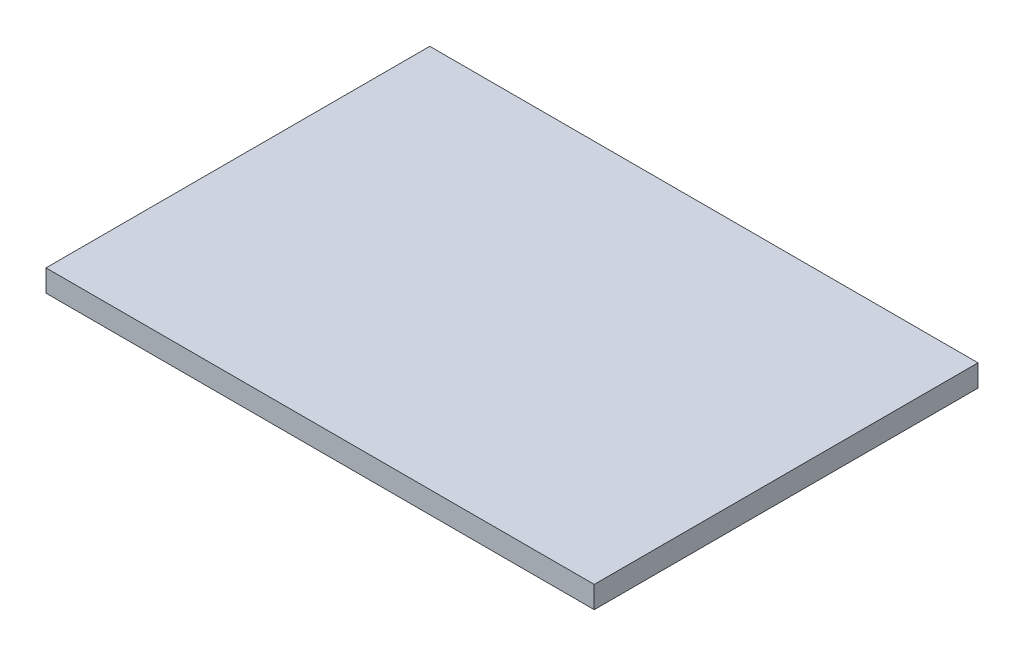
ISO-10303-21;
HEADER;
FILE_DESCRIPTION(('STEP AP214'),'2;1');
FILE_NAME('part.step','',(''),(''),'','','');
FILE_SCHEMA(('AUTOMOTIVE_DESIGN { 1 0 10303 214 1 1 1 1 }'));
ENDSEC;
DATA;
#1=APPLICATION_CONTEXT('core data for automotive mechanical design processes');
#2=APPLICATION_PROTOCOL_DEFINITION('international standard','automotive_design',2000,#1);
#3=PRODUCT_CONTEXT('',#1,'mechanical');
#4=PRODUCT('Part','Part','',(#3));
#5=PRODUCT_RELATED_PRODUCT_CATEGORY('part','',(#4));
#6=PRODUCT_DEFINITION_FORMATION('','',#4);
#7=PRODUCT_DEFINITION_CONTEXT('part definition',#1,'design');
#8=PRODUCT_DEFINITION('design','',#6,#7);
#9=PRODUCT_DEFINITION_SHAPE('','',#8);
#10=(LENGTH_UNIT() NAMED_UNIT(*) SI_UNIT(.MILLI.,.METRE.));
#11=(NAMED_UNIT(*) PLANE_ANGLE_UNIT() SI_UNIT($,.RADIAN.));
#12=(NAMED_UNIT(*) SI_UNIT($,.STERADIAN.) SOLID_ANGLE_UNIT());
#13=UNCERTAINTY_MEASURE_WITH_UNIT(LENGTH_MEASURE(1.E-05),#10,'distance_accuracy_value','');
#14=(GEOMETRIC_REPRESENTATION_CONTEXT(3) GLOBAL_UNCERTAINTY_ASSIGNED_CONTEXT((#13)) GLOBAL_UNIT_ASSIGNED_CONTEXT((#10,
#11,#12)) REPRESENTATION_CONTEXT('',''));
#15=CARTESIAN_POINT('',(0.,0.,0.));
#16=DIRECTION('',(0.,0.,1.));
#17=DIRECTION('',(1.,0.,0.));
#18=AXIS2_PLACEMENT_3D('',#15,#16,#17);
#19=CARTESIAN_POINT('',(13.97,127.,-13.97));
#20=DIRECTION('',(-1.,0.,0.));
#21=DIRECTION('',(0.,0.,1.));
#22=AXIS2_PLACEMENT_3D('',#19,#20,#21);
#23=PLANE('',#22);
#24=CARTESIAN_POINT('',(13.97,96.52,0.));
#25=DIRECTION('',(1.,0.,0.));
#26=DIRECTION('',(0.,0.,-1.));
#27=AXIS2_PLACEMENT_3D('',#24,#25,#26);
#28=CIRCLE('',#27,6.35);
#29=CARTESIAN_POINT('',(13.97,96.52,-6.35));
#30=VERTEX_POINT('',#29);
#31=EDGE_CURVE('E236',#30,#30,#28,.T.);
#32=ORIENTED_EDGE('',*,*,#31,.F.);
#33=EDGE_LOOP('',(#32));
#34=FACE_BOUND('',#33,.T.);
#35=CARTESIAN_POINT('',(13.97,78.74,0.));
#36=DIRECTION('',(1.,0.,0.));
#37=DIRECTION('',(0.,0.,-1.));
#38=AXIS2_PLACEMENT_3D('',#35,#36,#37);
#39=CIRCLE('',#38,6.35);
#40=CARTESIAN_POINT('',(13.97,78.74,-6.35));
#41=VERTEX_POINT('',#40);
#42=EDGE_CURVE('E235',#41,#41,#39,.T.);
#43=ORIENTED_EDGE('',*,*,#42,.F.);
#44=EDGE_LOOP('',(#43));
#45=FACE_BOUND('',#44,.T.);
#46=CARTESIAN_POINT('',(13.97,60.96,0.));
#47=DIRECTION('',(1.,0.,0.));
#48=DIRECTION('',(0.,0.,-1.));
#49=AXIS2_PLACEMENT_3D('',#46,#47,#48);
#50=CIRCLE('',#49,6.35);
#51=CARTESIAN_POINT('',(13.97,60.96,-6.35));
#52=VERTEX_POINT('',#51);
#53=EDGE_CURVE('E244',#52,#52,#50,.T.);
#54=ORIENTED_EDGE('',*,*,#53,.F.);
#55=EDGE_LOOP('',(#54));
#56=FACE_BOUND('',#55,.T.);
#57=CARTESIAN_POINT('',(13.97,43.18,0.));
#58=DIRECTION('',(1.,0.,0.));
#59=DIRECTION('',(0.,0.,-1.));
#60=AXIS2_PLACEMENT_3D('',#57,#58,#59);
#61=CIRCLE('',#60,6.35);
#62=CARTESIAN_POINT('',(13.97,43.18,-6.35));
#63=VERTEX_POINT('',#62);
#64=EDGE_CURVE('E252',#63,#63,#61,.T.);
#65=ORIENTED_EDGE('',*,*,#64,.F.);
#66=EDGE_LOOP('',(#65));
#67=FACE_BOUND('',#66,.T.);
#68=CARTESIAN_POINT('',(13.97,25.4,0.));
#69=DIRECTION('',(1.,0.,0.));
#70=DIRECTION('',(0.,0.,-1.));
#71=AXIS2_PLACEMENT_3D('',#68,#69,#70);
#72=CIRCLE('',#71,6.35);
#73=CARTESIAN_POINT('',(13.97,25.4,-6.35));
#74=VERTEX_POINT('',#73);
#75=EDGE_CURVE('E220',#74,#74,#72,.T.);
#76=ORIENTED_EDGE('',*,*,#75,.F.);
#77=EDGE_LOOP('',(#76));
#78=FACE_BOUND('',#77,.T.);
#79=DIRECTION('',(0.,0.,-1.));
#80=VECTOR('',#79,1.);
#81=CARTESIAN_POINT('',(13.97,127.,163.83));
#82=LINE('',#81,#80);
#83=CARTESIAN_POINT('',(13.97,127.,13.97));
#84=VERTEX_POINT('',#83);
#85=CARTESIAN_POINT('',(13.97,127.,-13.97));
#86=VERTEX_POINT('',#85);
#87=EDGE_CURVE('E11',#84,#86,#82,.T.);
#88=ORIENTED_EDGE('',*,*,#87,.F.);
#89=DIRECTION('',(0.,-1.,0.));
#90=VECTOR('',#89,1.);
#91=CARTESIAN_POINT('',(13.97,127.,13.97));
#92=LINE('',#91,#90);
#93=CARTESIAN_POINT('',(13.97,0.,13.97));
#94=VERTEX_POINT('',#93);
#95=EDGE_CURVE('E93',#84,#94,#92,.T.);
#96=ORIENTED_EDGE('',*,*,#95,.T.);
#97=DIRECTION('',(0.,0.,-1.));
#98=VECTOR('',#97,1.);
#99=CARTESIAN_POINT('',(13.97,0.,-13.97));
#100=LINE('',#99,#98);
#101=CARTESIAN_POINT('',(13.97,0.,-13.97));
#102=VERTEX_POINT('',#101);
#103=EDGE_CURVE('E106',#94,#102,#100,.T.);
#104=ORIENTED_EDGE('',*,*,#103,.T.);
#105=DIRECTION('',(0.,-1.,0.));
#106=VECTOR('',#105,1.);
#107=CARTESIAN_POINT('',(13.97,127.,-13.97));
#108=LINE('',#107,#106);
#109=EDGE_CURVE('E48',#86,#102,#108,.T.);
#110=ORIENTED_EDGE('',*,*,#109,.F.);
#111=EDGE_LOOP('',(#88,#96,#104,#110));
#112=FACE_BOUND('',#111,.T.);
#113=ADVANCED_FACE('F45',(#34,#45,#56,#67,#78,#112),#23,.F.);
#114=CARTESIAN_POINT('',(-13.97,127.,-13.97));
#115=DIRECTION('',(0.,0.,1.));
#116=DIRECTION('',(1.,0.,0.));
#117=AXIS2_PLACEMENT_3D('',#114,#115,#116);
#118=PLANE('',#117);
#119=DIRECTION('',(-1.,0.,0.));
#120=VECTOR('',#119,1.);
#121=CARTESIAN_POINT('',(-13.97,0.,-13.97));
#122=LINE('',#121,#120);
#123=CARTESIAN_POINT('',(-13.97,0.,-13.97));
#124=VERTEX_POINT('',#123);
#125=EDGE_CURVE('E112',#102,#124,#122,.T.);
#126=ORIENTED_EDGE('',*,*,#125,.T.);
#127=DIRECTION('',(0.,-1.,0.));
#128=VECTOR('',#127,1.);
#129=CARTESIAN_POINT('',(-13.97,127.,-13.97));
#130=LINE('',#129,#128);
#131=CARTESIAN_POINT('',(-13.97,127.,-13.97));
#132=VERTEX_POINT('',#131);
#133=EDGE_CURVE('E129',#132,#124,#130,.T.);
#134=ORIENTED_EDGE('',*,*,#133,.F.);
#135=DIRECTION('',(-1.,0.,0.));
#136=VECTOR('',#135,1.);
#137=CARTESIAN_POINT('',(13.97,127.,-13.97));
#138=LINE('',#137,#136);
#139=CARTESIAN_POINT('',(-36.83,127.,-13.97));
#140=VERTEX_POINT('',#139);
#141=EDGE_CURVE('E216',#132,#140,#138,.T.);
#142=ORIENTED_EDGE('',*,*,#141,.T.);
#143=DIRECTION('',(0.,-1.,0.));
#144=VECTOR('',#143,1.);
#145=CARTESIAN_POINT('',(-36.83,137.16,-13.97));
#146=LINE('',#145,#144);
#147=CARTESIAN_POINT('',(-36.83,137.16,-13.97));
#148=VERTEX_POINT('',#147);
#149=EDGE_CURVE('E198',#148,#140,#146,.T.);
#150=ORIENTED_EDGE('',*,*,#149,.F.);
#151=DIRECTION('',(-1.,0.,0.));
#152=VECTOR('',#151,1.);
#153=CARTESIAN_POINT('',(13.97,137.16,-13.97));
#154=LINE('',#153,#152);
#155=CARTESIAN_POINT('',(217.17,137.16,-13.97));
#156=VERTEX_POINT('',#155);
#157=EDGE_CURVE('E211',#156,#148,#154,.T.);
#158=ORIENTED_EDGE('',*,*,#157,.F.);
#159=DIRECTION('',(0.,1.,0.));
#160=VECTOR('',#159,1.);
#161=CARTESIAN_POINT('',(217.17,137.16,-13.97));
#162=LINE('',#161,#160);
#163=CARTESIAN_POINT('',(217.17,127.,-13.97));
#164=VERTEX_POINT('',#163);
#165=EDGE_CURVE('E276',#164,#156,#162,.T.);
#166=ORIENTED_EDGE('',*,*,#165,.F.);
#167=DIRECTION('',(-1.,0.,0.));
#168=VECTOR('',#167,1.);
#169=CARTESIAN_POINT('',(217.17,127.,-13.97));
#170=LINE('',#169,#168);
#171=EDGE_CURVE('E141',#164,#86,#170,.T.);
#172=ORIENTED_EDGE('',*,*,#171,.T.);
#173=ORIENTED_EDGE('',*,*,#109,.T.);
#174=EDGE_LOOP('',(#126,#134,#142,#150,#158,#166,#172,#173));
#175=FACE_BOUND('',#174,.T.);
#176=ADVANCED_FACE('F137',(#175),#118,.F.);
#177=CARTESIAN_POINT('',(-13.97,127.,-13.97));
#178=DIRECTION('',(1.,0.,0.));
#179=DIRECTION('',(0.,0.,-1.));
#180=AXIS2_PLACEMENT_3D('',#177,#178,#179);
#181=PLANE('',#180);
#182=DIRECTION('',(0.,0.,1.));
#183=VECTOR('',#182,1.);
#184=CARTESIAN_POINT('',(-13.97,0.,-13.97));
#185=LINE('',#184,#183);
#186=CARTESIAN_POINT('',(-13.97,0.,13.97));
#187=VERTEX_POINT('',#186);
#188=EDGE_CURVE('E100',#124,#187,#185,.T.);
#189=ORIENTED_EDGE('',*,*,#188,.T.);
#190=DIRECTION('',(0.,-1.,0.));
#191=VECTOR('',#190,1.);
#192=CARTESIAN_POINT('',(-13.97,127.,13.97));
#193=LINE('',#192,#191);
#194=CARTESIAN_POINT('',(-13.97,127.,13.97));
#195=VERTEX_POINT('',#194);
#196=EDGE_CURVE('E70',#195,#187,#193,.T.);
#197=ORIENTED_EDGE('',*,*,#196,.F.);
#198=DIRECTION('',(0.,0.,1.));
#199=VECTOR('',#198,1.);
#200=CARTESIAN_POINT('',(-13.97,127.,-13.97));
#201=LINE('',#200,#199);
#202=EDGE_CURVE('E99',#132,#195,#201,.T.);
#203=ORIENTED_EDGE('',*,*,#202,.F.);
#204=ORIENTED_EDGE('',*,*,#133,.T.);
#205=EDGE_LOOP('',(#189,#197,#203,#204));
#206=FACE_BOUND('',#205,.T.);
#207=ADVANCED_FACE('F334',(#206),#181,.F.);
#208=CARTESIAN_POINT('',(-13.97,127.,13.97));
#209=DIRECTION('',(0.,0.,-1.));
#210=DIRECTION('',(-1.,0.,0.));
#211=AXIS2_PLACEMENT_3D('',#208,#209,#210);
#212=PLANE('',#211);
#213=DIRECTION('',(1.,0.,0.));
#214=VECTOR('',#213,1.);
#215=CARTESIAN_POINT('',(-13.97,0.,13.97));
#216=LINE('',#215,#214);
#217=EDGE_CURVE('E89',#187,#94,#216,.T.);
#218=ORIENTED_EDGE('',*,*,#217,.T.);
#219=ORIENTED_EDGE('',*,*,#95,.F.);
#220=DIRECTION('',(1.,0.,0.));
#221=VECTOR('',#220,1.);
#222=CARTESIAN_POINT('',(-13.97,127.,13.97));
#223=LINE('',#222,#221);
#224=EDGE_CURVE('E108',#195,#84,#223,.T.);
#225=ORIENTED_EDGE('',*,*,#224,.F.);
#226=ORIENTED_EDGE('',*,*,#196,.T.);
#227=EDGE_LOOP('',(#218,#219,#225,#226));
#228=FACE_BOUND('',#227,.T.);
#229=ADVANCED_FACE('F91',(#228),#212,.F.);
#230=CARTESIAN_POINT('',(0.,0.,0.));
#231=DIRECTION('',(0.,1.,0.));
#232=DIRECTION('',(0.,0.,1.));
#233=AXIS2_PLACEMENT_3D('',#230,#231,#232);
#234=PLANE('',#233);
#235=DIRECTION('',(0.,0.,-1.));
#236=VECTOR('',#235,1.);
#237=CARTESIAN_POINT('',(-11.43,0.,-11.43));
#238=LINE('',#237,#236);
#239=CARTESIAN_POINT('',(-11.43,0.,11.43));
#240=VERTEX_POINT('',#239);
#241=CARTESIAN_POINT('',(-11.43,0.,-11.43));
#242=VERTEX_POINT('',#241);
#243=EDGE_CURVE('E192',#240,#242,#238,.T.);
#244=ORIENTED_EDGE('',*,*,#243,.F.);
#245=DIRECTION('',(-1.,0.,0.));
#246=VECTOR('',#245,1.);
#247=CARTESIAN_POINT('',(-11.43,0.,11.43));
#248=LINE('',#247,#246);
#249=CARTESIAN_POINT('',(11.43,0.,11.43));
#250=VERTEX_POINT('',#249);
#251=EDGE_CURVE('E188',#250,#240,#248,.T.);
#252=ORIENTED_EDGE('',*,*,#251,.F.);
#253=DIRECTION('',(0.,0.,1.));
#254=VECTOR('',#253,1.);
#255=CARTESIAN_POINT('',(11.43,0.,11.43));
#256=LINE('',#255,#254);
#257=CARTESIAN_POINT('',(11.43,0.,-11.43));
#258=VERTEX_POINT('',#257);
#259=EDGE_CURVE('E114',#258,#250,#256,.T.);
#260=ORIENTED_EDGE('',*,*,#259,.F.);
#261=DIRECTION('',(1.,0.,0.));
#262=VECTOR('',#261,1.);
#263=CARTESIAN_POINT('',(11.43,0.,-11.43));
#264=LINE('',#263,#262);
#265=EDGE_CURVE('E61',#242,#258,#264,.T.);
#266=ORIENTED_EDGE('',*,*,#265,.F.);
#267=EDGE_LOOP('',(#244,#252,#260,#266));
#268=FACE_BOUND('',#267,.T.);
#269=ORIENTED_EDGE('',*,*,#103,.F.);
#270=ORIENTED_EDGE('',*,*,#217,.F.);
#271=ORIENTED_EDGE('',*,*,#188,.F.);
#272=ORIENTED_EDGE('',*,*,#125,.F.);
#273=EDGE_LOOP('',(#269,#270,#271,#272));
#274=FACE_BOUND('',#273,.T.);
#275=ADVANCED_FACE('F111',(#268,#274),#234,.F.);
#276=CARTESIAN_POINT('',(-11.43,-0.001000000000001,11.43));
#277=DIRECTION('',(0.,0.,1.));
#278=DIRECTION('',(1.,0.,0.));
#279=AXIS2_PLACEMENT_3D('',#276,#277,#278);
#280=PLANE('',#279);
#281=ORIENTED_EDGE('',*,*,#251,.T.);
#282=DIRECTION('',(0.,1.,0.));
#283=VECTOR('',#282,1.);
#284=CARTESIAN_POINT('',(-11.43,-0.001000000000001,11.43));
#285=LINE('',#284,#283);
#286=CARTESIAN_POINT('',(-11.43,127.,11.43));
#287=VERTEX_POINT('',#286);
#288=EDGE_CURVE('E121',#240,#287,#285,.T.);
#289=ORIENTED_EDGE('',*,*,#288,.T.);
#290=DIRECTION('',(1.,0.,0.));
#291=VECTOR('',#290,1.);
#292=CARTESIAN_POINT('',(-11.43,127.,11.43));
#293=LINE('',#292,#291);
#294=CARTESIAN_POINT('',(11.43,127.,11.43));
#295=VERTEX_POINT('',#294);
#296=EDGE_CURVE('E184',#287,#295,#293,.T.);
#297=ORIENTED_EDGE('',*,*,#296,.T.);
#298=DIRECTION('',(0.,1.,0.));
#299=VECTOR('',#298,1.);
#300=CARTESIAN_POINT('',(11.43,-0.001000000000001,11.43));
#301=LINE('',#300,#299);
#302=EDGE_CURVE('E158',#250,#295,#301,.T.);
#303=ORIENTED_EDGE('',*,*,#302,.F.);
#304=EDGE_LOOP('',(#281,#289,#297,#303));
#305=FACE_BOUND('',#304,.T.);
#306=ADVANCED_FACE('F369',(#305),#280,.F.);
#307=CARTESIAN_POINT('',(-11.43,-0.001000000000001,-11.43));
#308=DIRECTION('',(-1.,0.,0.));
#309=DIRECTION('',(0.,0.,1.));
#310=AXIS2_PLACEMENT_3D('',#307,#308,#309);
#311=PLANE('',#310);
#312=ORIENTED_EDGE('',*,*,#243,.T.);
#313=DIRECTION('',(0.,1.,0.));
#314=VECTOR('',#313,1.);
#315=CARTESIAN_POINT('',(-11.43,-0.001000000000001,-11.43));
#316=LINE('',#315,#314);
#317=CARTESIAN_POINT('',(-11.43,127.,-11.43));
#318=VERTEX_POINT('',#317);
#319=EDGE_CURVE('E166',#242,#318,#316,.T.);
#320=ORIENTED_EDGE('',*,*,#319,.T.);
#321=DIRECTION('',(0.,0.,1.));
#322=VECTOR('',#321,1.);
#323=CARTESIAN_POINT('',(-11.43,127.,-11.43));
#324=LINE('',#323,#322);
#325=EDGE_CURVE('E163',#318,#287,#324,.T.);
#326=ORIENTED_EDGE('',*,*,#325,.T.);
#327=ORIENTED_EDGE('',*,*,#288,.F.);
#328=EDGE_LOOP('',(#312,#320,#326,#327));
#329=FACE_BOUND('',#328,.T.);
#330=ADVANCED_FACE('F418',(#329),#311,.F.);
#331=CARTESIAN_POINT('',(11.43,-0.001000000000001,-11.43));
#332=DIRECTION('',(0.,0.,-1.));
#333=DIRECTION('',(-1.,0.,0.));
#334=AXIS2_PLACEMENT_3D('',#331,#332,#333);
#335=PLANE('',#334);
#336=ORIENTED_EDGE('',*,*,#265,.T.);
#337=DIRECTION('',(0.,1.,0.));
#338=VECTOR('',#337,1.);
#339=CARTESIAN_POINT('',(11.43,-0.001000000000001,-11.43));
#340=LINE('',#339,#338);
#341=CARTESIAN_POINT('',(11.43,127.,-11.43));
#342=VERTEX_POINT('',#341);
#343=EDGE_CURVE('E162',#258,#342,#340,.T.);
#344=ORIENTED_EDGE('',*,*,#343,.T.);
#345=DIRECTION('',(-1.,0.,0.));
#346=VECTOR('',#345,1.);
#347=CARTESIAN_POINT('',(11.43,127.,-11.43));
#348=LINE('',#347,#346);
#349=EDGE_CURVE('E176',#342,#318,#348,.T.);
#350=ORIENTED_EDGE('',*,*,#349,.T.);
#351=ORIENTED_EDGE('',*,*,#319,.F.);
#352=EDGE_LOOP('',(#336,#344,#350,#351));
#353=FACE_BOUND('',#352,.T.);
#354=ADVANCED_FACE('F320',(#353),#335,.F.);
#355=CARTESIAN_POINT('',(11.43,-0.001000000000001,11.43));
#356=DIRECTION('',(1.,0.,0.));
#357=DIRECTION('',(0.,0.,-1.));
#358=AXIS2_PLACEMENT_3D('',#355,#356,#357);
#359=PLANE('',#358);
#360=CARTESIAN_POINT('',(11.43,25.4,0.));
#361=DIRECTION('',(1.,0.,0.));
#362=DIRECTION('',(0.,0.,-1.));
#363=AXIS2_PLACEMENT_3D('',#360,#361,#362);
#364=CIRCLE('',#363,6.35);
#365=CARTESIAN_POINT('',(11.43,25.4,-6.35));
#366=VERTEX_POINT('',#365);
#367=EDGE_CURVE('E260',#366,#366,#364,.F.);
#368=ORIENTED_EDGE('',*,*,#367,.F.);
#369=EDGE_LOOP('',(#368));
#370=FACE_BOUND('',#369,.T.);
#371=CARTESIAN_POINT('',(11.43,43.18,0.));
#372=DIRECTION('',(1.,0.,0.));
#373=DIRECTION('',(0.,0.,-1.));
#374=AXIS2_PLACEMENT_3D('',#371,#372,#373);
#375=CIRCLE('',#374,6.35);
#376=CARTESIAN_POINT('',(11.43,43.18,-6.35));
#377=VERTEX_POINT('',#376);
#378=EDGE_CURVE('E256',#377,#377,#375,.F.);
#379=ORIENTED_EDGE('',*,*,#378,.F.);
#380=EDGE_LOOP('',(#379));
#381=FACE_BOUND('',#380,.T.);
#382=CARTESIAN_POINT('',(11.43,60.96,0.));
#383=DIRECTION('',(1.,0.,0.));
#384=DIRECTION('',(0.,0.,-1.));
#385=AXIS2_PLACEMENT_3D('',#382,#383,#384);
#386=CIRCLE('',#385,6.35);
#387=CARTESIAN_POINT('',(11.43,60.96,-6.35));
#388=VERTEX_POINT('',#387);
#389=EDGE_CURVE('E248',#388,#388,#386,.F.);
#390=ORIENTED_EDGE('',*,*,#389,.F.);
#391=EDGE_LOOP('',(#390));
#392=FACE_BOUND('',#391,.T.);
#393=CARTESIAN_POINT('',(11.43,78.74,0.));
#394=DIRECTION('',(1.,0.,0.));
#395=DIRECTION('',(0.,0.,-1.));
#396=AXIS2_PLACEMENT_3D('',#393,#394,#395);
#397=CIRCLE('',#396,6.35);
#398=CARTESIAN_POINT('',(11.43,78.74,-6.35));
#399=VERTEX_POINT('',#398);
#400=EDGE_CURVE('E240',#399,#399,#397,.F.);
#401=ORIENTED_EDGE('',*,*,#400,.F.);
#402=EDGE_LOOP('',(#401));
#403=FACE_BOUND('',#402,.T.);
#404=CARTESIAN_POINT('',(11.43,96.52,0.));
#405=DIRECTION('',(1.,0.,0.));
#406=DIRECTION('',(0.,0.,-1.));
#407=AXIS2_PLACEMENT_3D('',#404,#405,#406);
#408=CIRCLE('',#407,6.35);
#409=CARTESIAN_POINT('',(11.43,96.52,-6.35));
#410=VERTEX_POINT('',#409);
#411=EDGE_CURVE('E231',#410,#410,#408,.F.);
#412=ORIENTED_EDGE('',*,*,#411,.F.);
#413=EDGE_LOOP('',(#412));
#414=FACE_BOUND('',#413,.T.);
#415=ORIENTED_EDGE('',*,*,#259,.T.);
#416=ORIENTED_EDGE('',*,*,#302,.T.);
#417=DIRECTION('',(0.,0.,-1.));
#418=VECTOR('',#417,1.);
#419=CARTESIAN_POINT('',(11.43,127.,11.43));
#420=LINE('',#419,#418);
#421=EDGE_CURVE('E180',#295,#342,#420,.T.);
#422=ORIENTED_EDGE('',*,*,#421,.T.);
#423=ORIENTED_EDGE('',*,*,#343,.F.);
#424=EDGE_LOOP('',(#415,#416,#422,#423));
#425=FACE_BOUND('',#424,.T.);
#426=ADVANCED_FACE('F309',(#370,#381,#392,#403,#414,#425),#359,.F.);
#427=CARTESIAN_POINT('',(0.,127.,0.));
#428=DIRECTION('',(0.,-1.,0.));
#429=DIRECTION('',(0.,0.,-1.));
#430=AXIS2_PLACEMENT_3D('',#427,#428,#429);
#431=PLANE('',#430);
#432=CARTESIAN_POINT('',(90.17,127.,43.5016652181971));
#433=DIRECTION('',(0.,-1.,0.));
#434=DIRECTION('',(0.,0.,-1.));
#435=AXIS2_PLACEMENT_3D('',#432,#433,#434);
#436=CIRCLE('',#435,7.50000000000001);
#437=CARTESIAN_POINT('',(90.17,127.,36.0016652181971));
#438=VERTEX_POINT('',#437);
#439=EDGE_CURVE('E289',#438,#438,#436,.T.);
#440=ORIENTED_EDGE('',*,*,#439,.F.);
#441=EDGE_LOOP('',(#440));
#442=FACE_BOUND('',#441,.T.);
#443=ORIENTED_EDGE('',*,*,#141,.F.);
#444=ORIENTED_EDGE('',*,*,#202,.T.);
#445=ORIENTED_EDGE('',*,*,#224,.T.);
#446=ORIENTED_EDGE('',*,*,#87,.T.);
#447=ORIENTED_EDGE('',*,*,#171,.F.);
#448=DIRECTION('',(0.,0.,-1.));
#449=VECTOR('',#448,1.);
#450=CARTESIAN_POINT('',(217.17,127.,163.83));
#451=LINE('',#450,#449);
#452=CARTESIAN_POINT('',(217.17,127.,163.83));
#453=VERTEX_POINT('',#452);
#454=EDGE_CURVE('E280',#453,#164,#451,.T.);
#455=ORIENTED_EDGE('',*,*,#454,.F.);
#456=DIRECTION('',(1.,0.,0.));
#457=VECTOR('',#456,1.);
#458=CARTESIAN_POINT('',(13.97,127.,163.83));
#459=LINE('',#458,#457);
#460=CARTESIAN_POINT('',(-36.83,127.,163.83));
#461=VERTEX_POINT('',#460);
#462=EDGE_CURVE('E207',#461,#453,#459,.T.);
#463=ORIENTED_EDGE('',*,*,#462,.F.);
#464=DIRECTION('',(0.,0.,1.));
#465=VECTOR('',#464,1.);
#466=CARTESIAN_POINT('',(-36.83,127.,-13.97));
#467=LINE('',#466,#465);
#468=EDGE_CURVE('E212',#140,#461,#467,.T.);
#469=ORIENTED_EDGE('',*,*,#468,.F.);
#470=EDGE_LOOP('',(#443,#444,#445,#446,#447,#455,#463,#469));
#471=FACE_BOUND('',#470,.T.);
#472=ADVANCED_FACE('F146',(#442,#471),#431,.T.);
#473=CARTESIAN_POINT('',(0.,137.16,0.));
#474=DIRECTION('',(0.,-1.,0.));
#475=DIRECTION('',(0.,0.,-1.));
#476=AXIS2_PLACEMENT_3D('',#473,#474,#475);
#477=PLANE('',#476);
#478=DIRECTION('',(1.,0.,0.));
#479=VECTOR('',#478,1.);
#480=CARTESIAN_POINT('',(13.97,137.16,163.83));
#481=LINE('',#480,#479);
#482=CARTESIAN_POINT('',(-36.83,137.16,163.83));
#483=VERTEX_POINT('',#482);
#484=CARTESIAN_POINT('',(217.17,137.16,163.83));
#485=VERTEX_POINT('',#484);
#486=EDGE_CURVE('E206',#483,#485,#481,.T.);
#487=ORIENTED_EDGE('',*,*,#486,.T.);
#488=DIRECTION('',(0.,0.,1.));
#489=VECTOR('',#488,1.);
#490=CARTESIAN_POINT('',(217.17,137.16,163.83));
#491=LINE('',#490,#489);
#492=EDGE_CURVE('E271',#156,#485,#491,.T.);
#493=ORIENTED_EDGE('',*,*,#492,.F.);
#494=ORIENTED_EDGE('',*,*,#157,.T.);
#495=DIRECTION('',(0.,0.,1.));
#496=VECTOR('',#495,1.);
#497=CARTESIAN_POINT('',(-36.83,137.16,-13.97));
#498=LINE('',#497,#496);
#499=EDGE_CURVE('E224',#148,#483,#498,.T.);
#500=ORIENTED_EDGE('',*,*,#499,.T.);
#501=EDGE_LOOP('',(#487,#493,#494,#500));
#502=FACE_BOUND('',#501,.T.);
#503=ADVANCED_FACE('F308',(#502),#477,.F.);
#504=CARTESIAN_POINT('',(13.97,137.16,163.83));
#505=DIRECTION('',(0.,0.,-1.));
#506=DIRECTION('',(-1.,0.,0.));
#507=AXIS2_PLACEMENT_3D('',#504,#505,#506);
#508=PLANE('',#507);
#509=ORIENTED_EDGE('',*,*,#462,.T.);
#510=DIRECTION('',(0.,-1.,0.));
#511=VECTOR('',#510,1.);
#512=CARTESIAN_POINT('',(217.17,137.16,163.83));
#513=LINE('',#512,#511);
#514=EDGE_CURVE('E284',#485,#453,#513,.T.);
#515=ORIENTED_EDGE('',*,*,#514,.F.);
#516=ORIENTED_EDGE('',*,*,#486,.F.);
#517=DIRECTION('',(0.,-1.,0.));
#518=VECTOR('',#517,1.);
#519=CARTESIAN_POINT('',(-36.83,137.16,163.83));
#520=LINE('',#519,#518);
#521=EDGE_CURVE('E202',#483,#461,#520,.T.);
#522=ORIENTED_EDGE('',*,*,#521,.T.);
#523=EDGE_LOOP('',(#509,#515,#516,#522));
#524=FACE_BOUND('',#523,.T.);
#525=ADVANCED_FACE('F316',(#524),#508,.F.);
#526=CARTESIAN_POINT('',(-36.83,137.16,-13.97));
#527=DIRECTION('',(1.,0.,0.));
#528=DIRECTION('',(0.,0.,-1.));
#529=AXIS2_PLACEMENT_3D('',#526,#527,#528);
#530=PLANE('',#529);
#531=ORIENTED_EDGE('',*,*,#468,.T.);
#532=ORIENTED_EDGE('',*,*,#521,.F.);
#533=ORIENTED_EDGE('',*,*,#499,.F.);
#534=ORIENTED_EDGE('',*,*,#149,.T.);
#535=EDGE_LOOP('',(#531,#532,#533,#534));
#536=FACE_BOUND('',#535,.T.);
#537=ADVANCED_FACE('F326',(#536),#530,.F.);
#538=ORIENTED_EDGE('',*,*,#296,.F.);
#539=ORIENTED_EDGE('',*,*,#325,.F.);
#540=ORIENTED_EDGE('',*,*,#349,.F.);
#541=ORIENTED_EDGE('',*,*,#421,.F.);
#542=EDGE_LOOP('',(#538,#539,#540,#541));
#543=FACE_BOUND('',#542,.T.);
#544=ADVANCED_FACE('F311',(#543),#431,.T.);
#545=CARTESIAN_POINT('',(-36.831,96.52,0.));
#546=DIRECTION('',(1.,0.,0.));
#547=DIRECTION('',(0.,0.,-1.));
#548=AXIS2_PLACEMENT_3D('',#545,#546,#547);
#549=CYLINDRICAL_SURFACE('',#548,6.35);
#550=ORIENTED_EDGE('',*,*,#31,.T.);
#551=EDGE_LOOP('',(#550));
#552=FACE_BOUND('',#551,.T.);
#553=ORIENTED_EDGE('',*,*,#411,.T.);
#554=EDGE_LOOP('',(#553));
#555=FACE_BOUND('',#554,.T.);
#556=ADVANCED_FACE('F325',(#552,#555),#549,.F.);
#557=CARTESIAN_POINT('',(-36.831,78.74,0.));
#558=DIRECTION('',(1.,0.,0.));
#559=DIRECTION('',(0.,0.,-1.));
#560=AXIS2_PLACEMENT_3D('',#557,#558,#559);
#561=CYLINDRICAL_SURFACE('',#560,6.35);
#562=ORIENTED_EDGE('',*,*,#42,.T.);
#563=EDGE_LOOP('',(#562));
#564=FACE_BOUND('',#563,.T.);
#565=ORIENTED_EDGE('',*,*,#400,.T.);
#566=EDGE_LOOP('',(#565));
#567=FACE_BOUND('',#566,.T.);
#568=ADVANCED_FACE('F461',(#564,#567),#561,.F.);
#569=CARTESIAN_POINT('',(-36.831,60.96,0.));
#570=DIRECTION('',(1.,0.,0.));
#571=DIRECTION('',(0.,0.,-1.));
#572=AXIS2_PLACEMENT_3D('',#569,#570,#571);
#573=CYLINDRICAL_SURFACE('',#572,6.35);
#574=ORIENTED_EDGE('',*,*,#53,.T.);
#575=EDGE_LOOP('',(#574));
#576=FACE_BOUND('',#575,.T.);
#577=ORIENTED_EDGE('',*,*,#389,.T.);
#578=EDGE_LOOP('',(#577));
#579=FACE_BOUND('',#578,.T.);
#580=ADVANCED_FACE('F457',(#576,#579),#573,.F.);
#581=CARTESIAN_POINT('',(-36.831,43.18,0.));
#582=DIRECTION('',(1.,0.,0.));
#583=DIRECTION('',(0.,0.,-1.));
#584=AXIS2_PLACEMENT_3D('',#581,#582,#583);
#585=CYLINDRICAL_SURFACE('',#584,6.35);
#586=ORIENTED_EDGE('',*,*,#64,.T.);
#587=EDGE_LOOP('',(#586));
#588=FACE_BOUND('',#587,.T.);
#589=ORIENTED_EDGE('',*,*,#378,.T.);
#590=EDGE_LOOP('',(#589));
#591=FACE_BOUND('',#590,.T.);
#592=ADVANCED_FACE('F347',(#588,#591),#585,.F.);
#593=CARTESIAN_POINT('',(-36.831,25.4,0.));
#594=DIRECTION('',(1.,0.,0.));
#595=DIRECTION('',(0.,0.,-1.));
#596=AXIS2_PLACEMENT_3D('',#593,#594,#595);
#597=CYLINDRICAL_SURFACE('',#596,6.35);
#598=ORIENTED_EDGE('',*,*,#75,.T.);
#599=EDGE_LOOP('',(#598));
#600=FACE_BOUND('',#599,.T.);
#601=ORIENTED_EDGE('',*,*,#367,.T.);
#602=EDGE_LOOP('',(#601));
#603=FACE_BOUND('',#602,.T.);
#604=ADVANCED_FACE('F345',(#600,#603),#597,.F.);
#605=CARTESIAN_POINT('',(217.17,0.,0.));
#606=DIRECTION('',(1.,0.,0.));
#607=DIRECTION('',(0.,0.,-1.));
#608=AXIS2_PLACEMENT_3D('',#605,#606,#607);
#609=PLANE('',#608);
#610=ORIENTED_EDGE('',*,*,#514,.T.);
#611=ORIENTED_EDGE('',*,*,#454,.T.);
#612=ORIENTED_EDGE('',*,*,#165,.T.);
#613=ORIENTED_EDGE('',*,*,#492,.T.);
#614=EDGE_LOOP('',(#610,#611,#612,#613));
#615=FACE_BOUND('',#614,.T.);
#616=ADVANCED_FACE('F303',(#615),#609,.T.);
#617=CARTESIAN_POINT('',(90.17,132.08,43.5016652181971));
#618=DIRECTION('',(0.,-1.,0.));
#619=DIRECTION('',(0.,0.,-1.));
#620=AXIS2_PLACEMENT_3D('',#617,#618,#619);
#621=CYLINDRICAL_SURFACE('',#620,7.50000000000001);
#622=CARTESIAN_POINT('',(90.17,132.08,43.5016652181971));
#623=DIRECTION('',(0.,-1.,0.));
#624=DIRECTION('',(0.,0.,-1.));
#625=AXIS2_PLACEMENT_3D('',#622,#623,#624);
#626=CIRCLE('',#625,7.50000000000001);
#627=CARTESIAN_POINT('',(90.17,132.08,36.0016652181971));
#628=VERTEX_POINT('',#627);
#629=EDGE_CURVE('E288',#628,#628,#626,.T.);
#630=ORIENTED_EDGE('',*,*,#629,.F.);
#631=EDGE_LOOP('',(#630));
#632=FACE_BOUND('',#631,.T.);
#633=ORIENTED_EDGE('',*,*,#439,.T.);
#634=EDGE_LOOP('',(#633));
#635=FACE_BOUND('',#634,.T.);
#636=ADVANCED_FACE('F300',(#632,#635),#621,.F.);
#637=CARTESIAN_POINT('',(90.17,132.08,43.5016652181971));
#638=DIRECTION('',(0.,-1.,0.));
#639=DIRECTION('',(0.,0.,-1.));
#640=AXIS2_PLACEMENT_3D('',#637,#638,#639);
#641=PLANE('',#640);
#642=ORIENTED_EDGE('',*,*,#629,.T.);
#643=EDGE_LOOP('',(#642));
#644=FACE_BOUND('',#643,.T.);
#645=ADVANCED_FACE('F298',(#644),#641,.T.);
#646=CLOSED_SHELL('',(#113,#176,#207,#229,#275,#306,#330,#354,#426,#472,#503,#525,#537,#544,
#556,#568,#580,#592,#604,#616,#636,#645));
#647=MANIFOLD_SOLID_BREP('B2',#646);
#648=ADVANCED_BREP_SHAPE_REPRESENTATION('',(#18,#647),#14);
#649=SHAPE_DEFINITION_REPRESENTATION(#9,#648);
ENDSEC;
END-ISO-10303-21;
